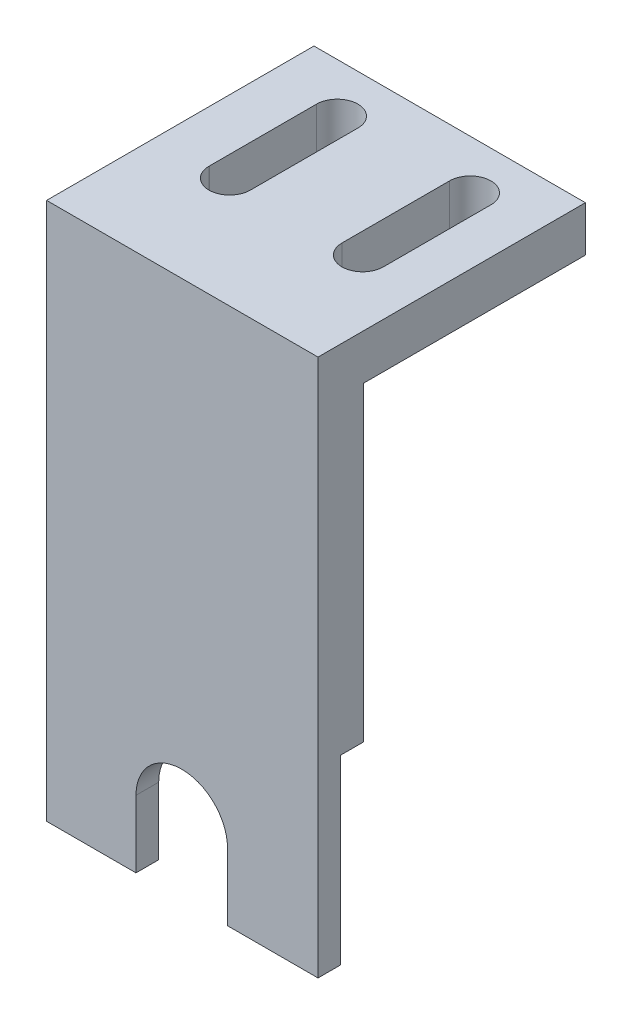
ISO-10303-21;
HEADER;
FILE_DESCRIPTION(('STEP AP214'),'2;1');
FILE_NAME('part.step','',(''),(''),'','','');
FILE_SCHEMA(('AUTOMOTIVE_DESIGN { 1 0 10303 214 1 1 1 1 }'));
ENDSEC;
DATA;
#1=APPLICATION_CONTEXT('core data for automotive mechanical design processes');
#2=APPLICATION_PROTOCOL_DEFINITION('international standard','automotive_design',2000,#1);
#3=PRODUCT_CONTEXT('',#1,'mechanical');
#4=PRODUCT('Part','Part','',(#3));
#5=PRODUCT_RELATED_PRODUCT_CATEGORY('part','',(#4));
#6=PRODUCT_DEFINITION_FORMATION('','',#4);
#7=PRODUCT_DEFINITION_CONTEXT('part definition',#1,'design');
#8=PRODUCT_DEFINITION('design','',#6,#7);
#9=PRODUCT_DEFINITION_SHAPE('','',#8);
#10=(LENGTH_UNIT() NAMED_UNIT(*) SI_UNIT(.MILLI.,.METRE.));
#11=(NAMED_UNIT(*) PLANE_ANGLE_UNIT() SI_UNIT($,.RADIAN.));
#12=(NAMED_UNIT(*) SI_UNIT($,.STERADIAN.) SOLID_ANGLE_UNIT());
#13=UNCERTAINTY_MEASURE_WITH_UNIT(LENGTH_MEASURE(1.E-05),#10,'distance_accuracy_value','');
#14=(GEOMETRIC_REPRESENTATION_CONTEXT(3) GLOBAL_UNCERTAINTY_ASSIGNED_CONTEXT((#13)) GLOBAL_UNIT_ASSIGNED_CONTEXT((#10,
#11,#12)) REPRESENTATION_CONTEXT('',''));
#15=CARTESIAN_POINT('',(0.,0.,0.));
#16=DIRECTION('',(0.,0.,1.));
#17=DIRECTION('',(1.,0.,0.));
#18=AXIS2_PLACEMENT_3D('',#15,#16,#17);
#19=CARTESIAN_POINT('',(18.9738,-37.592,-1.5875));
#20=DIRECTION('',(0.,1.,0.));
#21=DIRECTION('',(0.,0.,1.));
#22=AXIS2_PLACEMENT_3D('',#19,#20,#21);
#23=PLANE('',#22);
#24=DIRECTION('',(-1.,0.,0.));
#25=VECTOR('',#24,1.);
#26=CARTESIAN_POINT('',(18.9738,-37.592,0.));
#27=LINE('',#26,#25);
#28=CARTESIAN_POINT('',(18.9738,-37.592,0.));
#29=VERTEX_POINT('',#28);
#30=CARTESIAN_POINT('',(12.6492,-37.592,0.));
#31=VERTEX_POINT('',#30);
#32=EDGE_CURVE('E194',#29,#31,#27,.T.);
#33=ORIENTED_EDGE('',*,*,#32,.T.);
#34=DIRECTION('',(0.,0.,-1.));
#35=VECTOR('',#34,1.);
#36=CARTESIAN_POINT('',(12.6492,-37.592,0.));
#37=LINE('',#36,#35);
#38=CARTESIAN_POINT('',(12.6492,-37.592,-1.5875));
#39=VERTEX_POINT('',#38);
#40=EDGE_CURVE('E224',#31,#39,#37,.T.);
#41=ORIENTED_EDGE('',*,*,#40,.T.);
#42=DIRECTION('',(-1.,0.,0.));
#43=VECTOR('',#42,1.);
#44=CARTESIAN_POINT('',(18.9738,-37.592,-1.5875));
#45=LINE('',#44,#43);
#46=CARTESIAN_POINT('',(18.9738,-37.592,-1.5875));
#47=VERTEX_POINT('',#46);
#48=EDGE_CURVE('E195',#47,#39,#45,.T.);
#49=ORIENTED_EDGE('',*,*,#48,.F.);
#50=DIRECTION('',(0.,0.,-1.));
#51=VECTOR('',#50,1.);
#52=CARTESIAN_POINT('',(18.9738,-37.592,-1.5875));
#53=LINE('',#52,#51);
#54=EDGE_CURVE('E305',#29,#47,#53,.T.);
#55=ORIENTED_EDGE('',*,*,#54,.F.);
#56=EDGE_LOOP('',(#33,#41,#49,#55));
#57=FACE_BOUND('',#56,.T.);
#58=ADVANCED_FACE('F17',(#57),#23,.F.);
#59=CARTESIAN_POINT('',(18.9738,-3.175,-18.692090909091));
#60=DIRECTION('',(0.,1.,0.));
#61=DIRECTION('',(0.,0.,1.));
#62=AXIS2_PLACEMENT_3D('',#59,#60,#61);
#63=PLANE('',#62);
#64=DIRECTION('',(0.,0.,-1.));
#65=VECTOR('',#64,1.);
#66=CARTESIAN_POINT('',(0.,-3.175,-18.692090909091));
#67=LINE('',#66,#65);
#68=CARTESIAN_POINT('',(0.,-3.175,-3.175));
#69=VERTEX_POINT('',#68);
#70=CARTESIAN_POINT('',(0.,-3.175,-18.692090909091));
#71=VERTEX_POINT('',#70);
#72=EDGE_CURVE('E330',#69,#71,#67,.T.);
#73=ORIENTED_EDGE('',*,*,#72,.T.);
#74=DIRECTION('',(-1.,0.,0.));
#75=VECTOR('',#74,1.);
#76=CARTESIAN_POINT('',(18.9738,-3.175,-18.692090909091));
#77=LINE('',#76,#75);
#78=CARTESIAN_POINT('',(18.9738,-3.175,-18.692090909091));
#79=VERTEX_POINT('',#78);
#80=EDGE_CURVE('E339',#79,#71,#77,.T.);
#81=ORIENTED_EDGE('',*,*,#80,.F.);
#82=DIRECTION('',(0.,0.,-1.));
#83=VECTOR('',#82,1.);
#84=CARTESIAN_POINT('',(18.9738,-3.175,-18.692090909091));
#85=LINE('',#84,#83);
#86=CARTESIAN_POINT('',(18.9738,-3.175,-3.175));
#87=VERTEX_POINT('',#86);
#88=EDGE_CURVE('E314',#87,#79,#85,.T.);
#89=ORIENTED_EDGE('',*,*,#88,.F.);
#90=DIRECTION('',(-1.,0.,0.));
#91=VECTOR('',#90,1.);
#92=CARTESIAN_POINT('',(18.9738,-3.175,-3.175));
#93=LINE('',#92,#91);
#94=EDGE_CURVE('E342',#87,#69,#93,.T.);
#95=ORIENTED_EDGE('',*,*,#94,.T.);
#96=EDGE_LOOP('',(#73,#81,#89,#95));
#97=FACE_BOUND('',#96,.T.);
#98=CARTESIAN_POINT('',(14.351,-3.175,-7.74469090909104));
#99=DIRECTION('',(0.,1.,0.));
#100=DIRECTION('',(0.,0.,1.));
#101=AXIS2_PLACEMENT_3D('',#98,#99,#100);
#102=CIRCLE('',#101,1.4478);
#103=CARTESIAN_POINT('',(12.9032,-3.175,-7.74469090909104));
#104=VERTEX_POINT('',#103);
#105=CARTESIAN_POINT('',(15.7988,-3.175,-7.74469090909104));
#106=VERTEX_POINT('',#105);
#107=EDGE_CURVE('E284',#104,#106,#102,.T.);
#108=ORIENTED_EDGE('',*,*,#107,.T.);
#109=DIRECTION('',(0.,0.,-1.));
#110=VECTOR('',#109,1.);
#111=CARTESIAN_POINT('',(15.7988,-3.175,-18.692090909091));
#112=LINE('',#111,#110);
#113=CARTESIAN_POINT('',(15.7988,-3.175,-15.2630909090911));
#114=VERTEX_POINT('',#113);
#115=EDGE_CURVE('E287',#106,#114,#112,.T.);
#116=ORIENTED_EDGE('',*,*,#115,.T.);
#117=CARTESIAN_POINT('',(14.351,-3.175,-15.2630909090911));
#118=DIRECTION('',(0.,1.,0.));
#119=DIRECTION('',(0.,0.,1.));
#120=AXIS2_PLACEMENT_3D('',#117,#118,#119);
#121=CIRCLE('',#120,1.4478);
#122=CARTESIAN_POINT('',(12.9032,-3.175,-15.2630909090911));
#123=VERTEX_POINT('',#122);
#124=EDGE_CURVE('E253',#114,#123,#121,.T.);
#125=ORIENTED_EDGE('',*,*,#124,.T.);
#126=DIRECTION('',(0.,0.,1.));
#127=VECTOR('',#126,1.);
#128=CARTESIAN_POINT('',(12.9032,-3.175,-18.692090909091));
#129=LINE('',#128,#127);
#130=EDGE_CURVE('E281',#123,#104,#129,.T.);
#131=ORIENTED_EDGE('',*,*,#130,.T.);
#132=EDGE_LOOP('',(#108,#116,#125,#131));
#133=FACE_BOUND('',#132,.T.);
#134=DIRECTION('',(0.0100562168217008,0.,-0.999949434973207));
#135=VECTOR('',#134,1.);
#136=CARTESIAN_POINT('',(3.7184378876018,-3.175,-18.8455098958221));
#137=LINE('',#136,#135);
#138=CARTESIAN_POINT('',(3.6068,-3.175,-7.74469090909104));
#139=VERTEX_POINT('',#138);
#140=CARTESIAN_POINT('',(3.60709282477963,-3.175,-7.77380821812795));
#141=VERTEX_POINT('',#140);
#142=EDGE_CURVE('E300',#139,#141,#137,.T.);
#143=ORIENTED_EDGE('',*,*,#142,.F.);
#144=CARTESIAN_POINT('',(5.0546,-3.175,-7.74469090909104));
#145=DIRECTION('',(0.,1.,0.));
#146=DIRECTION('',(0.,0.,1.));
#147=AXIS2_PLACEMENT_3D('',#144,#145,#146);
#148=CIRCLE('',#147,1.4478);
#149=CARTESIAN_POINT('',(6.5024,-3.175,-7.74469090909104));
#150=VERTEX_POINT('',#149);
#151=EDGE_CURVE('E290',#139,#150,#148,.T.);
#152=ORIENTED_EDGE('',*,*,#151,.T.);
#153=DIRECTION('',(0.,0.,1.));
#154=VECTOR('',#153,1.);
#155=CARTESIAN_POINT('',(6.5024,-3.175,-18.692090909091));
#156=LINE('',#155,#154);
#157=CARTESIAN_POINT('',(6.5024,-3.175,-15.2630909090911));
#158=VERTEX_POINT('',#157);
#159=EDGE_CURVE('E293',#158,#150,#156,.T.);
#160=ORIENTED_EDGE('',*,*,#159,.F.);
#161=CARTESIAN_POINT('',(5.0546,-3.175,-15.2630909090911));
#162=DIRECTION('',(0.,1.,0.));
#163=DIRECTION('',(0.,0.,1.));
#164=AXIS2_PLACEMENT_3D('',#161,#162,#163);
#165=CIRCLE('',#164,1.4478);
#166=CARTESIAN_POINT('',(3.6068,-3.175,-15.2630909090911));
#167=VERTEX_POINT('',#166);
#168=EDGE_CURVE('E295',#158,#167,#165,.T.);
#169=ORIENTED_EDGE('',*,*,#168,.T.);
#170=DIRECTION('',(-3.90991756479628E-05,0.,-0.999999999235627));
#171=VECTOR('',#170,1.);
#172=CARTESIAN_POINT('',(3.60666595241904,-3.175,-18.6914900668173));
#173=LINE('',#172,#171);
#174=EDGE_CURVE('E298',#141,#167,#173,.T.);
#175=ORIENTED_EDGE('',*,*,#174,.F.);
#176=EDGE_LOOP('',(#143,#152,#160,#169,#175));
#177=FACE_BOUND('',#176,.T.);
#178=ADVANCED_FACE('F395',(#97,#133,#177),#63,.F.);
#179=CARTESIAN_POINT('',(18.9738,0.,0.));
#180=DIRECTION('',(0.,-1.,0.));
#181=DIRECTION('',(0.,0.,-1.));
#182=AXIS2_PLACEMENT_3D('',#179,#180,#181);
#183=PLANE('',#182);
#184=DIRECTION('',(0.,0.,1.));
#185=VECTOR('',#184,1.);
#186=CARTESIAN_POINT('',(0.,0.,0.));
#187=LINE('',#186,#185);
#188=CARTESIAN_POINT('',(0.,0.,-18.692090909091));
#189=VERTEX_POINT('',#188);
#190=CARTESIAN_POINT('',(0.,0.,0.));
#191=VERTEX_POINT('',#190);
#192=EDGE_CURVE('E306',#189,#191,#187,.T.);
#193=ORIENTED_EDGE('',*,*,#192,.T.);
#194=DIRECTION('',(-1.,0.,0.));
#195=VECTOR('',#194,1.);
#196=CARTESIAN_POINT('',(18.9738,0.,0.));
#197=LINE('',#196,#195);
#198=CARTESIAN_POINT('',(18.9738,0.,0.));
#199=VERTEX_POINT('',#198);
#200=EDGE_CURVE('E320',#199,#191,#197,.T.);
#201=ORIENTED_EDGE('',*,*,#200,.F.);
#202=DIRECTION('',(0.,0.,1.));
#203=VECTOR('',#202,1.);
#204=CARTESIAN_POINT('',(18.9738,0.,0.));
#205=LINE('',#204,#203);
#206=CARTESIAN_POINT('',(18.9738,0.,-18.692090909091));
#207=VERTEX_POINT('',#206);
#208=EDGE_CURVE('E318',#207,#199,#205,.T.);
#209=ORIENTED_EDGE('',*,*,#208,.F.);
#210=DIRECTION('',(-1.,0.,0.));
#211=VECTOR('',#210,1.);
#212=CARTESIAN_POINT('',(18.9738,0.,-18.692090909091));
#213=LINE('',#212,#211);
#214=EDGE_CURVE('E336',#207,#189,#213,.T.);
#215=ORIENTED_EDGE('',*,*,#214,.T.);
#216=EDGE_LOOP('',(#193,#201,#209,#215));
#217=FACE_BOUND('',#216,.T.);
#218=CARTESIAN_POINT('',(14.351,0.,-15.2630909090911));
#219=DIRECTION('',(0.,1.,0.));
#220=DIRECTION('',(0.,0.,1.));
#221=AXIS2_PLACEMENT_3D('',#218,#219,#220);
#222=CIRCLE('',#221,1.4478);
#223=CARTESIAN_POINT('',(15.7988,0.,-15.2630909090911));
#224=VERTEX_POINT('',#223);
#225=CARTESIAN_POINT('',(12.9032,0.,-15.2630909090911));
#226=VERTEX_POINT('',#225);
#227=EDGE_CURVE('E262',#224,#226,#222,.T.);
#228=ORIENTED_EDGE('',*,*,#227,.F.);
#229=DIRECTION('',(0.,0.,-1.));
#230=VECTOR('',#229,1.);
#231=CARTESIAN_POINT('',(15.7988,0.,0.));
#232=LINE('',#231,#230);
#233=CARTESIAN_POINT('',(15.7988,0.,-7.74469090909104));
#234=VERTEX_POINT('',#233);
#235=EDGE_CURVE('E226',#234,#224,#232,.T.);
#236=ORIENTED_EDGE('',*,*,#235,.F.);
#237=CARTESIAN_POINT('',(14.351,0.,-7.74469090909104));
#238=DIRECTION('',(0.,1.,0.));
#239=DIRECTION('',(0.,0.,1.));
#240=AXIS2_PLACEMENT_3D('',#237,#238,#239);
#241=CIRCLE('',#240,1.4478);
#242=CARTESIAN_POINT('',(12.9032,0.,-7.74469090909104));
#243=VERTEX_POINT('',#242);
#244=EDGE_CURVE('E268',#243,#234,#241,.T.);
#245=ORIENTED_EDGE('',*,*,#244,.F.);
#246=DIRECTION('',(0.,0.,1.));
#247=VECTOR('',#246,1.);
#248=CARTESIAN_POINT('',(12.9032,0.,0.));
#249=LINE('',#248,#247);
#250=EDGE_CURVE('E265',#226,#243,#249,.T.);
#251=ORIENTED_EDGE('',*,*,#250,.F.);
#252=EDGE_LOOP('',(#228,#236,#245,#251));
#253=FACE_BOUND('',#252,.T.);
#254=DIRECTION('',(0.0100562168217008,0.,-0.999949434973207));
#255=VECTOR('',#254,1.);
#256=CARTESIAN_POINT('',(3.52855690046592,0.,0.0354857275955606));
#257=LINE('',#256,#255);
#258=CARTESIAN_POINT('',(3.6068,0.,-7.74469090909104));
#259=VERTEX_POINT('',#258);
#260=CARTESIAN_POINT('',(3.60709282477963,0.,-7.77380821812795));
#261=VERTEX_POINT('',#260);
#262=EDGE_CURVE('E235',#259,#261,#257,.T.);
#263=ORIENTED_EDGE('',*,*,#262,.T.);
#264=DIRECTION('',(-3.90991756479628E-05,0.,-0.999999999235627));
#265=VECTOR('',#264,1.);
#266=CARTESIAN_POINT('',(3.60739676875805,0.,-0.000141046240001376));
#267=LINE('',#266,#265);
#268=CARTESIAN_POINT('',(3.6068,0.,-15.2630909090911));
#269=VERTEX_POINT('',#268);
#270=EDGE_CURVE('E247',#261,#269,#267,.T.);
#271=ORIENTED_EDGE('',*,*,#270,.T.);
#272=CARTESIAN_POINT('',(5.0546,0.,-15.2630909090911));
#273=DIRECTION('',(0.,1.,0.));
#274=DIRECTION('',(0.,0.,1.));
#275=AXIS2_PLACEMENT_3D('',#272,#273,#274);
#276=CIRCLE('',#275,1.4478);
#277=CARTESIAN_POINT('',(6.5024,0.,-15.2630909090911));
#278=VERTEX_POINT('',#277);
#279=EDGE_CURVE('E244',#278,#269,#276,.T.);
#280=ORIENTED_EDGE('',*,*,#279,.F.);
#281=DIRECTION('',(0.,0.,1.));
#282=VECTOR('',#281,1.);
#283=CARTESIAN_POINT('',(6.5024,0.,0.));
#284=LINE('',#283,#282);
#285=CARTESIAN_POINT('',(6.5024,0.,-7.74469090909104));
#286=VERTEX_POINT('',#285);
#287=EDGE_CURVE('E241',#278,#286,#284,.T.);
#288=ORIENTED_EDGE('',*,*,#287,.T.);
#289=CARTESIAN_POINT('',(5.0546,0.,-7.74469090909104));
#290=DIRECTION('',(0.,1.,0.));
#291=DIRECTION('',(0.,0.,1.));
#292=AXIS2_PLACEMENT_3D('',#289,#290,#291);
#293=CIRCLE('',#292,1.4478);
#294=EDGE_CURVE('E238',#259,#286,#293,.T.);
#295=ORIENTED_EDGE('',*,*,#294,.F.);
#296=EDGE_LOOP('',(#263,#271,#280,#288,#295));
#297=FACE_BOUND('',#296,.T.);
#298=ADVANCED_FACE('F400',(#217,#253,#297),#183,.F.);
#299=CARTESIAN_POINT('',(18.9738,-37.592,0.));
#300=DIRECTION('',(0.,0.,-1.));
#301=DIRECTION('',(-1.,0.,0.));
#302=AXIS2_PLACEMENT_3D('',#299,#300,#301);
#303=PLANE('',#302);
#304=CARTESIAN_POINT('',(9.4742,-32.893,0.));
#305=DIRECTION('',(0.,0.,-1.));
#306=DIRECTION('',(0.,-1.,0.));
#307=AXIS2_PLACEMENT_3D('',#304,#305,#306);
#308=CIRCLE('',#307,3.175);
#309=CARTESIAN_POINT('',(9.4742,-29.718,0.));
#310=VERTEX_POINT('',#309);
#311=CARTESIAN_POINT('',(12.6492,-32.893,0.));
#312=VERTEX_POINT('',#311);
#313=EDGE_CURVE('E374',#310,#312,#308,.T.);
#314=ORIENTED_EDGE('',*,*,#313,.T.);
#315=DIRECTION('',(0.,-1.,0.));
#316=VECTOR('',#315,1.);
#317=CARTESIAN_POINT('',(12.6492,-37.592,0.));
#318=LINE('',#317,#316);
#319=EDGE_CURVE('E187',#312,#31,#318,.T.);
#320=ORIENTED_EDGE('',*,*,#319,.T.);
#321=ORIENTED_EDGE('',*,*,#32,.F.);
#322=DIRECTION('',(0.,-1.,0.));
#323=VECTOR('',#322,1.);
#324=CARTESIAN_POINT('',(18.9738,-37.592,0.));
#325=LINE('',#324,#323);
#326=EDGE_CURVE('E302',#199,#29,#325,.T.);
#327=ORIENTED_EDGE('',*,*,#326,.F.);
#328=ORIENTED_EDGE('',*,*,#200,.T.);
#329=DIRECTION('',(0.,-1.,0.));
#330=VECTOR('',#329,1.);
#331=CARTESIAN_POINT('',(0.,-37.592,0.));
#332=LINE('',#331,#330);
#333=CARTESIAN_POINT('',(0.,-37.592,0.));
#334=VERTEX_POINT('',#333);
#335=EDGE_CURVE('E193',#191,#334,#332,.T.);
#336=ORIENTED_EDGE('',*,*,#335,.T.);
#337=CARTESIAN_POINT('',(6.2484,-37.592,0.));
#338=VERTEX_POINT('',#337);
#339=EDGE_CURVE('E184',#338,#334,#27,.T.);
#340=ORIENTED_EDGE('',*,*,#339,.F.);
#341=DIRECTION('',(0.,1.,0.));
#342=VECTOR('',#341,1.);
#343=CARTESIAN_POINT('',(6.2484,-32.893,0.));
#344=LINE('',#343,#342);
#345=CARTESIAN_POINT('',(6.2484,-32.893,0.));
#346=VERTEX_POINT('',#345);
#347=EDGE_CURVE('E170',#338,#346,#344,.T.);
#348=ORIENTED_EDGE('',*,*,#347,.T.);
#349=CARTESIAN_POINT('',(9.4234,-32.893,0.));
#350=DIRECTION('',(0.,0.,-1.));
#351=DIRECTION('',(0.,-1.,0.));
#352=AXIS2_PLACEMENT_3D('',#349,#350,#351);
#353=CIRCLE('',#352,3.175);
#354=CARTESIAN_POINT('',(9.4234,-29.718,0.));
#355=VERTEX_POINT('',#354);
#356=EDGE_CURVE('E178',#346,#355,#353,.T.);
#357=ORIENTED_EDGE('',*,*,#356,.T.);
#358=DIRECTION('',(1.,0.,0.));
#359=VECTOR('',#358,1.);
#360=CARTESIAN_POINT('',(9.4742,-29.718,0.));
#361=LINE('',#360,#359);
#362=EDGE_CURVE('E375',#355,#310,#361,.T.);
#363=ORIENTED_EDGE('',*,*,#362,.T.);
#364=EDGE_LOOP('',(#314,#320,#321,#327,#328,#336,#340,#348,#357,#363));
#365=FACE_BOUND('',#364,.T.);
#366=ADVANCED_FACE('F19',(#365),#303,.F.);
#367=CARTESIAN_POINT('',(6.2484,-37.592,-1.5875));
#368=VERTEX_POINT('',#367);
#369=CARTESIAN_POINT('',(0.,-37.592,-1.5875));
#370=VERTEX_POINT('',#369);
#371=EDGE_CURVE('E186',#368,#370,#45,.T.);
#372=ORIENTED_EDGE('',*,*,#371,.F.);
#373=DIRECTION('',(0.,0.,-1.));
#374=VECTOR('',#373,1.);
#375=CARTESIAN_POINT('',(6.2484,-37.592,0.));
#376=LINE('',#375,#374);
#377=EDGE_CURVE('E32',#338,#368,#376,.T.);
#378=ORIENTED_EDGE('',*,*,#377,.F.);
#379=ORIENTED_EDGE('',*,*,#339,.T.);
#380=DIRECTION('',(0.,0.,-1.));
#381=VECTOR('',#380,1.);
#382=CARTESIAN_POINT('',(0.,-37.592,-1.5875));
#383=LINE('',#382,#381);
#384=EDGE_CURVE('E322',#334,#370,#383,.T.);
#385=ORIENTED_EDGE('',*,*,#384,.T.);
#386=EDGE_LOOP('',(#372,#378,#379,#385));
#387=FACE_BOUND('',#386,.T.);
#388=ADVANCED_FACE('F182',(#387),#23,.F.);
#389=CARTESIAN_POINT('',(18.9738,-24.892,-1.5875));
#390=DIRECTION('',(0.,0.,1.));
#391=DIRECTION('',(0.,-1.,0.));
#392=AXIS2_PLACEMENT_3D('',#389,#390,#391);
#393=PLANE('',#392);
#394=ORIENTED_EDGE('',*,*,#48,.T.);
#395=DIRECTION('',(0.,1.,0.));
#396=VECTOR('',#395,1.);
#397=CARTESIAN_POINT('',(12.6492,-24.892,-1.5875));
#398=LINE('',#397,#396);
#399=CARTESIAN_POINT('',(12.6492,-32.893,-1.5875));
#400=VERTEX_POINT('',#399);
#401=EDGE_CURVE('E11',#39,#400,#398,.T.);
#402=ORIENTED_EDGE('',*,*,#401,.T.);
#403=CARTESIAN_POINT('',(9.4742,-32.893,-1.5875));
#404=DIRECTION('',(0.,0.,1.));
#405=DIRECTION('',(0.,-1.,0.));
#406=AXIS2_PLACEMENT_3D('',#403,#404,#405);
#407=CIRCLE('',#406,3.175);
#408=CARTESIAN_POINT('',(9.4742,-29.718,-1.5875));
#409=VERTEX_POINT('',#408);
#410=EDGE_CURVE('E25',#400,#409,#407,.T.);
#411=ORIENTED_EDGE('',*,*,#410,.T.);
#412=DIRECTION('',(-1.,0.,0.));
#413=VECTOR('',#412,1.);
#414=CARTESIAN_POINT('',(18.9738,-29.718,-1.5875));
#415=LINE('',#414,#413);
#416=CARTESIAN_POINT('',(9.4234,-29.718,-1.5875));
#417=VERTEX_POINT('',#416);
#418=EDGE_CURVE('E207',#409,#417,#415,.T.);
#419=ORIENTED_EDGE('',*,*,#418,.T.);
#420=CARTESIAN_POINT('',(9.4234,-32.893,-1.5875));
#421=DIRECTION('',(0.,0.,1.));
#422=DIRECTION('',(0.,-1.,0.));
#423=AXIS2_PLACEMENT_3D('',#420,#421,#422);
#424=CIRCLE('',#423,3.175);
#425=CARTESIAN_POINT('',(6.2484,-32.893,-1.5875));
#426=VERTEX_POINT('',#425);
#427=EDGE_CURVE('E204',#417,#426,#424,.T.);
#428=ORIENTED_EDGE('',*,*,#427,.T.);
#429=DIRECTION('',(0.,-1.,0.));
#430=VECTOR('',#429,1.);
#431=CARTESIAN_POINT('',(6.2484,-24.892,-1.5875));
#432=LINE('',#431,#430);
#433=EDGE_CURVE('E198',#426,#368,#432,.T.);
#434=ORIENTED_EDGE('',*,*,#433,.T.);
#435=ORIENTED_EDGE('',*,*,#371,.T.);
#436=DIRECTION('',(0.,1.,0.));
#437=VECTOR('',#436,1.);
#438=CARTESIAN_POINT('',(0.,-24.892,-1.5875));
#439=LINE('',#438,#437);
#440=CARTESIAN_POINT('',(0.,-24.892,-1.5875));
#441=VERTEX_POINT('',#440);
#442=EDGE_CURVE('E324',#370,#441,#439,.T.);
#443=ORIENTED_EDGE('',*,*,#442,.T.);
#444=DIRECTION('',(-1.,0.,0.));
#445=VECTOR('',#444,1.);
#446=CARTESIAN_POINT('',(18.9738,-24.892,-1.5875));
#447=LINE('',#446,#445);
#448=CARTESIAN_POINT('',(18.9738,-24.892,-1.5875));
#449=VERTEX_POINT('',#448);
#450=EDGE_CURVE('E347',#449,#441,#447,.T.);
#451=ORIENTED_EDGE('',*,*,#450,.F.);
#452=DIRECTION('',(0.,1.,0.));
#453=VECTOR('',#452,1.);
#454=CARTESIAN_POINT('',(18.9738,-24.892,-1.5875));
#455=LINE('',#454,#453);
#456=EDGE_CURVE('E308',#47,#449,#455,.T.);
#457=ORIENTED_EDGE('',*,*,#456,.F.);
#458=EDGE_LOOP('',(#394,#402,#411,#419,#428,#434,#435,#443,#451,#457));
#459=FACE_BOUND('',#458,.T.);
#460=ADVANCED_FACE('F211',(#459),#393,.F.);
#461=CARTESIAN_POINT('',(18.9738,-24.892,-3.175));
#462=DIRECTION('',(0.,1.,0.));
#463=DIRECTION('',(0.,0.,1.));
#464=AXIS2_PLACEMENT_3D('',#461,#462,#463);
#465=PLANE('',#464);
#466=DIRECTION('',(0.,0.,-1.));
#467=VECTOR('',#466,1.);
#468=CARTESIAN_POINT('',(0.,-24.892,-3.175));
#469=LINE('',#468,#467);
#470=CARTESIAN_POINT('',(0.,-24.892,-3.175));
#471=VERTEX_POINT('',#470);
#472=EDGE_CURVE('E326',#441,#471,#469,.T.);
#473=ORIENTED_EDGE('',*,*,#472,.T.);
#474=DIRECTION('',(-1.,0.,0.));
#475=VECTOR('',#474,1.);
#476=CARTESIAN_POINT('',(18.9738,-24.892,-3.175));
#477=LINE('',#476,#475);
#478=CARTESIAN_POINT('',(18.9738,-24.892,-3.175));
#479=VERTEX_POINT('',#478);
#480=EDGE_CURVE('E345',#479,#471,#477,.T.);
#481=ORIENTED_EDGE('',*,*,#480,.F.);
#482=DIRECTION('',(0.,0.,-1.));
#483=VECTOR('',#482,1.);
#484=CARTESIAN_POINT('',(18.9738,-24.892,-3.175));
#485=LINE('',#484,#483);
#486=EDGE_CURVE('E310',#449,#479,#485,.T.);
#487=ORIENTED_EDGE('',*,*,#486,.F.);
#488=ORIENTED_EDGE('',*,*,#450,.T.);
#489=EDGE_LOOP('',(#473,#481,#487,#488));
#490=FACE_BOUND('',#489,.T.);
#491=ADVANCED_FACE('F359',(#490),#465,.F.);
#492=CARTESIAN_POINT('',(18.9738,-3.175,-3.175));
#493=DIRECTION('',(0.,0.,1.));
#494=DIRECTION('',(0.,-1.,0.));
#495=AXIS2_PLACEMENT_3D('',#492,#493,#494);
#496=PLANE('',#495);
#497=DIRECTION('',(0.,1.,0.));
#498=VECTOR('',#497,1.);
#499=CARTESIAN_POINT('',(0.,-3.175,-3.175));
#500=LINE('',#499,#498);
#501=EDGE_CURVE('E328',#471,#69,#500,.T.);
#502=ORIENTED_EDGE('',*,*,#501,.T.);
#503=ORIENTED_EDGE('',*,*,#94,.F.);
#504=DIRECTION('',(0.,1.,0.));
#505=VECTOR('',#504,1.);
#506=CARTESIAN_POINT('',(18.9738,-3.175,-3.175));
#507=LINE('',#506,#505);
#508=EDGE_CURVE('E312',#479,#87,#507,.T.);
#509=ORIENTED_EDGE('',*,*,#508,.F.);
#510=ORIENTED_EDGE('',*,*,#480,.T.);
#511=EDGE_LOOP('',(#502,#503,#509,#510));
#512=FACE_BOUND('',#511,.T.);
#513=ADVANCED_FACE('F362',(#512),#496,.F.);
#514=CARTESIAN_POINT('',(18.9738,0.,-18.692090909091));
#515=DIRECTION('',(0.,0.,1.));
#516=DIRECTION('',(1.,0.,0.));
#517=AXIS2_PLACEMENT_3D('',#514,#515,#516);
#518=PLANE('',#517);
#519=DIRECTION('',(0.,1.,0.));
#520=VECTOR('',#519,1.);
#521=CARTESIAN_POINT('',(0.,0.,-18.692090909091));
#522=LINE('',#521,#520);
#523=EDGE_CURVE('E332',#71,#189,#522,.T.);
#524=ORIENTED_EDGE('',*,*,#523,.T.);
#525=ORIENTED_EDGE('',*,*,#214,.F.);
#526=DIRECTION('',(0.,1.,0.));
#527=VECTOR('',#526,1.);
#528=CARTESIAN_POINT('',(18.9738,0.,-18.692090909091));
#529=LINE('',#528,#527);
#530=EDGE_CURVE('E316',#79,#207,#529,.T.);
#531=ORIENTED_EDGE('',*,*,#530,.F.);
#532=ORIENTED_EDGE('',*,*,#80,.T.);
#533=EDGE_LOOP('',(#524,#525,#531,#532));
#534=FACE_BOUND('',#533,.T.);
#535=ADVANCED_FACE('F423',(#534),#518,.F.);
#536=CARTESIAN_POINT('',(18.9738,0.,0.));
#537=DIRECTION('',(-1.,0.,0.));
#538=DIRECTION('',(0.,0.,1.));
#539=AXIS2_PLACEMENT_3D('',#536,#537,#538);
#540=PLANE('',#539);
#541=ORIENTED_EDGE('',*,*,#326,.T.);
#542=ORIENTED_EDGE('',*,*,#54,.T.);
#543=ORIENTED_EDGE('',*,*,#456,.T.);
#544=ORIENTED_EDGE('',*,*,#486,.T.);
#545=ORIENTED_EDGE('',*,*,#508,.T.);
#546=ORIENTED_EDGE('',*,*,#88,.T.);
#547=ORIENTED_EDGE('',*,*,#530,.T.);
#548=ORIENTED_EDGE('',*,*,#208,.T.);
#549=EDGE_LOOP('',(#541,#542,#543,#544,#545,#546,#547,#548));
#550=FACE_BOUND('',#549,.T.);
#551=ADVANCED_FACE('F366',(#550),#540,.F.);
#552=CARTESIAN_POINT('',(0.,0.,0.));
#553=DIRECTION('',(-1.,0.,0.));
#554=DIRECTION('',(0.,0.,1.));
#555=AXIS2_PLACEMENT_3D('',#552,#553,#554);
#556=PLANE('',#555);
#557=ORIENTED_EDGE('',*,*,#335,.F.);
#558=ORIENTED_EDGE('',*,*,#192,.F.);
#559=ORIENTED_EDGE('',*,*,#523,.F.);
#560=ORIENTED_EDGE('',*,*,#72,.F.);
#561=ORIENTED_EDGE('',*,*,#501,.F.);
#562=ORIENTED_EDGE('',*,*,#472,.F.);
#563=ORIENTED_EDGE('',*,*,#442,.F.);
#564=ORIENTED_EDGE('',*,*,#384,.F.);
#565=EDGE_LOOP('',(#557,#558,#559,#560,#561,#562,#563,#564));
#566=FACE_BOUND('',#565,.T.);
#567=ADVANCED_FACE('F355',(#566),#556,.T.);
#568=CARTESIAN_POINT('',(15.7988,-37.592,0.));
#569=DIRECTION('',(1.,0.,0.));
#570=DIRECTION('',(0.,0.,-1.));
#571=AXIS2_PLACEMENT_3D('',#568,#569,#570);
#572=PLANE('',#571);
#573=DIRECTION('',(0.,1.,0.));
#574=VECTOR('',#573,1.);
#575=CARTESIAN_POINT('',(15.7988,-37.592,-7.74469090909104));
#576=LINE('',#575,#574);
#577=EDGE_CURVE('E239',#106,#234,#576,.T.);
#578=ORIENTED_EDGE('',*,*,#577,.T.);
#579=ORIENTED_EDGE('',*,*,#235,.T.);
#580=DIRECTION('',(0.,1.,0.));
#581=VECTOR('',#580,1.);
#582=CARTESIAN_POINT('',(15.7988,-37.592,-15.2630909090911));
#583=LINE('',#582,#581);
#584=EDGE_CURVE('E271',#114,#224,#583,.T.);
#585=ORIENTED_EDGE('',*,*,#584,.F.);
#586=ORIENTED_EDGE('',*,*,#115,.F.);
#587=EDGE_LOOP('',(#578,#579,#585,#586));
#588=FACE_BOUND('',#587,.T.);
#589=ADVANCED_FACE('F462',(#588),#572,.F.);
#590=CARTESIAN_POINT('',(14.351,-37.592,-7.74469090909104));
#591=DIRECTION('',(0.,1.,0.));
#592=DIRECTION('',(0.,0.,1.));
#593=AXIS2_PLACEMENT_3D('',#590,#591,#592);
#594=CYLINDRICAL_SURFACE('',#593,1.4478);
#595=DIRECTION('',(0.,1.,0.));
#596=VECTOR('',#595,1.);
#597=CARTESIAN_POINT('',(12.9032,-37.592,-7.74469090909104));
#598=LINE('',#597,#596);
#599=EDGE_CURVE('E273',#104,#243,#598,.T.);
#600=ORIENTED_EDGE('',*,*,#599,.T.);
#601=ORIENTED_EDGE('',*,*,#244,.T.);
#602=ORIENTED_EDGE('',*,*,#577,.F.);
#603=ORIENTED_EDGE('',*,*,#107,.F.);
#604=EDGE_LOOP('',(#600,#601,#602,#603));
#605=FACE_BOUND('',#604,.T.);
#606=ADVANCED_FACE('F469',(#605),#594,.F.);
#607=CARTESIAN_POINT('',(12.9032,-37.592,0.));
#608=DIRECTION('',(-1.,0.,0.));
#609=DIRECTION('',(0.,0.,1.));
#610=AXIS2_PLACEMENT_3D('',#607,#608,#609);
#611=PLANE('',#610);
#612=DIRECTION('',(0.,1.,0.));
#613=VECTOR('',#612,1.);
#614=CARTESIAN_POINT('',(12.9032,-37.592,-15.2630909090911));
#615=LINE('',#614,#613);
#616=EDGE_CURVE('E275',#123,#226,#615,.T.);
#617=ORIENTED_EDGE('',*,*,#616,.T.);
#618=ORIENTED_EDGE('',*,*,#250,.T.);
#619=ORIENTED_EDGE('',*,*,#599,.F.);
#620=ORIENTED_EDGE('',*,*,#130,.F.);
#621=EDGE_LOOP('',(#617,#618,#619,#620));
#622=FACE_BOUND('',#621,.T.);
#623=ADVANCED_FACE('F478',(#622),#611,.F.);
#624=CARTESIAN_POINT('',(14.351,-37.592,-15.2630909090911));
#625=DIRECTION('',(0.,1.,0.));
#626=DIRECTION('',(0.,0.,1.));
#627=AXIS2_PLACEMENT_3D('',#624,#625,#626);
#628=CYLINDRICAL_SURFACE('',#627,1.4478);
#629=ORIENTED_EDGE('',*,*,#584,.T.);
#630=ORIENTED_EDGE('',*,*,#227,.T.);
#631=ORIENTED_EDGE('',*,*,#616,.F.);
#632=ORIENTED_EDGE('',*,*,#124,.F.);
#633=EDGE_LOOP('',(#629,#630,#631,#632));
#634=FACE_BOUND('',#633,.T.);
#635=ADVANCED_FACE('F487',(#634),#628,.F.);
#636=CARTESIAN_POINT('',(3.52855690046592,-37.592,0.0354857275955606));
#637=DIRECTION('',(0.999949434973206,0.,0.0100562168217008));
#638=DIRECTION('',(0.0100562168217008,0.,-0.999949434973207));
#639=AXIS2_PLACEMENT_3D('',#636,#637,#638);
#640=PLANE('',#639);
#641=ORIENTED_EDGE('',*,*,#142,.T.);
#642=DIRECTION('',(0.,1.,0.));
#643=VECTOR('',#642,1.);
#644=CARTESIAN_POINT('',(3.60709282477963,-37.592,-7.77380821812795));
#645=LINE('',#644,#643);
#646=EDGE_CURVE('E251',#141,#261,#645,.T.);
#647=ORIENTED_EDGE('',*,*,#646,.T.);
#648=ORIENTED_EDGE('',*,*,#262,.F.);
#649=DIRECTION('',(0.,1.,0.));
#650=VECTOR('',#649,1.);
#651=CARTESIAN_POINT('',(3.6068,-37.592,-7.74469090909104));
#652=LINE('',#651,#650);
#653=EDGE_CURVE('E250',#139,#259,#652,.T.);
#654=ORIENTED_EDGE('',*,*,#653,.F.);
#655=EDGE_LOOP('',(#641,#647,#648,#654));
#656=FACE_BOUND('',#655,.T.);
#657=ADVANCED_FACE('F496',(#656),#640,.T.);
#658=CARTESIAN_POINT('',(3.60739676875805,-37.592,-0.000141046240001376));
#659=DIRECTION('',(0.999999999235627,0.,-3.90991756479628E-05));
#660=DIRECTION('',(-3.90991756479628E-05,0.,-0.999999999235627));
#661=AXIS2_PLACEMENT_3D('',#658,#659,#660);
#662=PLANE('',#661);
#663=ORIENTED_EDGE('',*,*,#174,.T.);
#664=DIRECTION('',(0.,1.,0.));
#665=VECTOR('',#664,1.);
#666=CARTESIAN_POINT('',(3.6068,-37.592,-15.2630909090911));
#667=LINE('',#666,#665);
#668=EDGE_CURVE('E254',#167,#269,#667,.T.);
#669=ORIENTED_EDGE('',*,*,#668,.T.);
#670=ORIENTED_EDGE('',*,*,#270,.F.);
#671=ORIENTED_EDGE('',*,*,#646,.F.);
#672=EDGE_LOOP('',(#663,#669,#670,#671));
#673=FACE_BOUND('',#672,.T.);
#674=ADVANCED_FACE('F505',(#673),#662,.T.);
#675=CARTESIAN_POINT('',(5.0546,-37.592,-15.2630909090911));
#676=DIRECTION('',(0.,1.,0.));
#677=DIRECTION('',(0.,0.,1.));
#678=AXIS2_PLACEMENT_3D('',#675,#676,#677);
#679=CYLINDRICAL_SURFACE('',#678,1.4478);
#680=DIRECTION('',(0.,1.,0.));
#681=VECTOR('',#680,1.);
#682=CARTESIAN_POINT('',(6.5024,-37.592,-15.2630909090911));
#683=LINE('',#682,#681);
#684=EDGE_CURVE('E256',#158,#278,#683,.T.);
#685=ORIENTED_EDGE('',*,*,#684,.T.);
#686=ORIENTED_EDGE('',*,*,#279,.T.);
#687=ORIENTED_EDGE('',*,*,#668,.F.);
#688=ORIENTED_EDGE('',*,*,#168,.F.);
#689=EDGE_LOOP('',(#685,#686,#687,#688));
#690=FACE_BOUND('',#689,.T.);
#691=ADVANCED_FACE('F514',(#690),#679,.F.);
#692=CARTESIAN_POINT('',(6.5024,-37.592,0.));
#693=DIRECTION('',(-1.,0.,0.));
#694=DIRECTION('',(0.,0.,1.));
#695=AXIS2_PLACEMENT_3D('',#692,#693,#694);
#696=PLANE('',#695);
#697=ORIENTED_EDGE('',*,*,#159,.T.);
#698=DIRECTION('',(0.,1.,0.));
#699=VECTOR('',#698,1.);
#700=CARTESIAN_POINT('',(6.5024,-37.592,-7.74469090909104));
#701=LINE('',#700,#699);
#702=EDGE_CURVE('E40',#150,#286,#701,.T.);
#703=ORIENTED_EDGE('',*,*,#702,.T.);
#704=ORIENTED_EDGE('',*,*,#287,.F.);
#705=ORIENTED_EDGE('',*,*,#684,.F.);
#706=EDGE_LOOP('',(#697,#703,#704,#705));
#707=FACE_BOUND('',#706,.T.);
#708=ADVANCED_FACE('F523',(#707),#696,.T.);
#709=CARTESIAN_POINT('',(5.0546,-37.592,-7.74469090909104));
#710=DIRECTION('',(0.,1.,0.));
#711=DIRECTION('',(0.,0.,1.));
#712=AXIS2_PLACEMENT_3D('',#709,#710,#711);
#713=CYLINDRICAL_SURFACE('',#712,1.4478);
#714=ORIENTED_EDGE('',*,*,#653,.T.);
#715=ORIENTED_EDGE('',*,*,#294,.T.);
#716=ORIENTED_EDGE('',*,*,#702,.F.);
#717=ORIENTED_EDGE('',*,*,#151,.F.);
#718=EDGE_LOOP('',(#714,#715,#716,#717));
#719=FACE_BOUND('',#718,.T.);
#720=ADVANCED_FACE('F532',(#719),#713,.F.);
#721=CARTESIAN_POINT('',(12.6492,-37.592,0.));
#722=DIRECTION('',(1.,0.,0.));
#723=DIRECTION('',(0.,0.,-1.));
#724=AXIS2_PLACEMENT_3D('',#721,#722,#723);
#725=PLANE('',#724);
#726=ORIENTED_EDGE('',*,*,#40,.F.);
#727=ORIENTED_EDGE('',*,*,#319,.F.);
#728=DIRECTION('',(0.,0.,-1.));
#729=VECTOR('',#728,1.);
#730=CARTESIAN_POINT('',(12.6492,-32.893,0.));
#731=LINE('',#730,#729);
#732=EDGE_CURVE('E217',#312,#400,#731,.T.);
#733=ORIENTED_EDGE('',*,*,#732,.T.);
#734=ORIENTED_EDGE('',*,*,#401,.F.);
#735=EDGE_LOOP('',(#726,#727,#733,#734));
#736=FACE_BOUND('',#735,.T.);
#737=ADVANCED_FACE('F221',(#736),#725,.F.);
#738=CARTESIAN_POINT('',(9.4742,-32.893,0.));
#739=DIRECTION('',(0.,0.,-1.));
#740=DIRECTION('',(0.,1.,0.));
#741=AXIS2_PLACEMENT_3D('',#738,#739,#740);
#742=CYLINDRICAL_SURFACE('',#741,3.175);
#743=ORIENTED_EDGE('',*,*,#732,.F.);
#744=ORIENTED_EDGE('',*,*,#313,.F.);
#745=DIRECTION('',(0.,0.,-1.));
#746=VECTOR('',#745,1.);
#747=CARTESIAN_POINT('',(9.4742,-29.718,0.));
#748=LINE('',#747,#746);
#749=EDGE_CURVE('E219',#310,#409,#748,.T.);
#750=ORIENTED_EDGE('',*,*,#749,.T.);
#751=ORIENTED_EDGE('',*,*,#410,.F.);
#752=EDGE_LOOP('',(#743,#744,#750,#751));
#753=FACE_BOUND('',#752,.T.);
#754=ADVANCED_FACE('F215',(#753),#742,.F.);
#755=CARTESIAN_POINT('',(9.4742,-29.718,0.));
#756=DIRECTION('',(0.,1.,0.));
#757=DIRECTION('',(0.,0.,1.));
#758=AXIS2_PLACEMENT_3D('',#755,#756,#757);
#759=PLANE('',#758);
#760=ORIENTED_EDGE('',*,*,#749,.F.);
#761=ORIENTED_EDGE('',*,*,#362,.F.);
#762=DIRECTION('',(0.,0.,-1.));
#763=VECTOR('',#762,1.);
#764=CARTESIAN_POINT('',(9.4234,-29.718,0.));
#765=LINE('',#764,#763);
#766=EDGE_CURVE('E228',#355,#417,#765,.T.);
#767=ORIENTED_EDGE('',*,*,#766,.T.);
#768=ORIENTED_EDGE('',*,*,#418,.F.);
#769=EDGE_LOOP('',(#760,#761,#767,#768));
#770=FACE_BOUND('',#769,.T.);
#771=ADVANCED_FACE('F383',(#770),#759,.F.);
#772=CARTESIAN_POINT('',(9.4234,-32.893,0.));
#773=DIRECTION('',(0.,0.,-1.));
#774=DIRECTION('',(0.,1.,0.));
#775=AXIS2_PLACEMENT_3D('',#772,#773,#774);
#776=CYLINDRICAL_SURFACE('',#775,3.175);
#777=ORIENTED_EDGE('',*,*,#766,.F.);
#778=ORIENTED_EDGE('',*,*,#356,.F.);
#779=DIRECTION('',(0.,0.,-1.));
#780=VECTOR('',#779,1.);
#781=CARTESIAN_POINT('',(6.2484,-32.893,0.));
#782=LINE('',#781,#780);
#783=EDGE_CURVE('E173',#346,#426,#782,.T.);
#784=ORIENTED_EDGE('',*,*,#783,.T.);
#785=ORIENTED_EDGE('',*,*,#427,.F.);
#786=EDGE_LOOP('',(#777,#778,#784,#785));
#787=FACE_BOUND('',#786,.T.);
#788=ADVANCED_FACE('F381',(#787),#776,.F.);
#789=CARTESIAN_POINT('',(6.2484,-32.893,0.));
#790=DIRECTION('',(-1.,0.,0.));
#791=DIRECTION('',(0.,0.,1.));
#792=AXIS2_PLACEMENT_3D('',#789,#790,#791);
#793=PLANE('',#792);
#794=ORIENTED_EDGE('',*,*,#783,.F.);
#795=ORIENTED_EDGE('',*,*,#347,.F.);
#796=ORIENTED_EDGE('',*,*,#377,.T.);
#797=ORIENTED_EDGE('',*,*,#433,.F.);
#798=EDGE_LOOP('',(#794,#795,#796,#797));
#799=FACE_BOUND('',#798,.T.);
#800=ADVANCED_FACE('F171',(#799),#793,.F.);
#801=CLOSED_SHELL('',(#58,#178,#298,#366,#388,#460,#491,#513,#535,#551,#567,#589,#606,#623,#635,
#657,#674,#691,#708,#720,#737,#754,#771,#788,#800));
#802=MANIFOLD_SOLID_BREP('B1',#801);
#803=ADVANCED_BREP_SHAPE_REPRESENTATION('',(#18,#802),#14);
#804=SHAPE_DEFINITION_REPRESENTATION(#9,#803);
ENDSEC;
END-ISO-10303-21;
